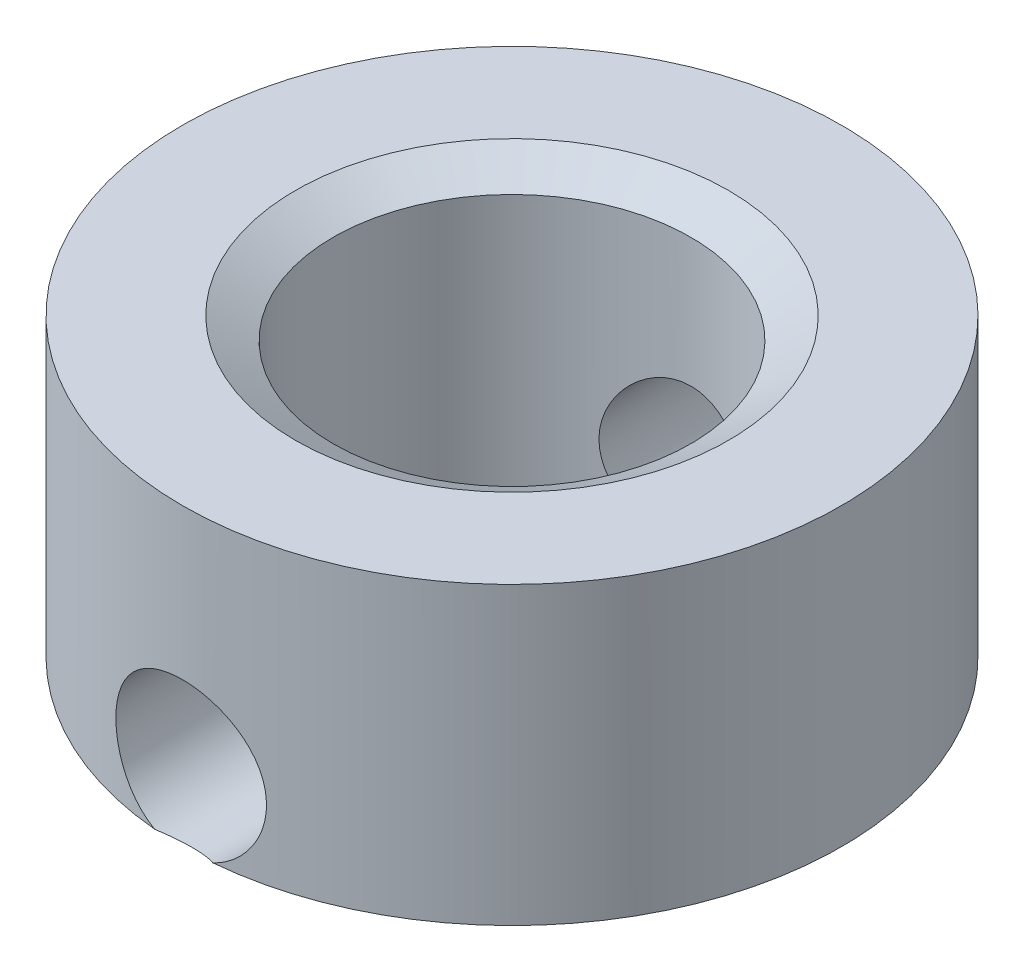
ISO-10303-21;
HEADER;
FILE_DESCRIPTION(('STEP AP214'),'2;1');
FILE_NAME('part.step','',(''),(''),'','','');
FILE_SCHEMA(('AUTOMOTIVE_DESIGN { 1 0 10303 214 1 1 1 1 }'));
ENDSEC;
DATA;
#1=APPLICATION_CONTEXT('core data for automotive mechanical design processes');
#2=APPLICATION_PROTOCOL_DEFINITION('international standard','automotive_design',2000,#1);
#3=PRODUCT_CONTEXT('',#1,'mechanical');
#4=PRODUCT('Part','Part','',(#3));
#5=PRODUCT_RELATED_PRODUCT_CATEGORY('part','',(#4));
#6=PRODUCT_DEFINITION_FORMATION('','',#4);
#7=PRODUCT_DEFINITION_CONTEXT('part definition',#1,'design');
#8=PRODUCT_DEFINITION('design','',#6,#7);
#9=PRODUCT_DEFINITION_SHAPE('','',#8);
#10=(LENGTH_UNIT() NAMED_UNIT(*) SI_UNIT(.MILLI.,.METRE.));
#11=(NAMED_UNIT(*) PLANE_ANGLE_UNIT() SI_UNIT($,.RADIAN.));
#12=(NAMED_UNIT(*) SI_UNIT($,.STERADIAN.) SOLID_ANGLE_UNIT());
#13=UNCERTAINTY_MEASURE_WITH_UNIT(LENGTH_MEASURE(1.E-05),#10,'distance_accuracy_value','');
#14=(GEOMETRIC_REPRESENTATION_CONTEXT(3) GLOBAL_UNCERTAINTY_ASSIGNED_CONTEXT((#13)) GLOBAL_UNIT_ASSIGNED_CONTEXT((#10,
#11,#12)) REPRESENTATION_CONTEXT('',''));
#15=CARTESIAN_POINT('',(0.,0.,0.));
#16=DIRECTION('',(0.,0.,1.));
#17=DIRECTION('',(1.,0.,0.));
#18=AXIS2_PLACEMENT_3D('',#15,#16,#17);
#19=CARTESIAN_POINT('',(0.,4.5,0.));
#20=DIRECTION('',(0.,1.,0.));
#21=DIRECTION('',(0.,0.,1.));
#22=AXIS2_PLACEMENT_3D('',#19,#20,#21);
#23=PLANE('',#22);
#24=CARTESIAN_POINT('',(0.,4.5,0.));
#25=DIRECTION('',(0.,1.,0.));
#26=DIRECTION('',(0.,0.,1.));
#27=AXIS2_PLACEMENT_3D('',#24,#25,#26);
#28=CIRCLE('',#27,2.875);
#29=CARTESIAN_POINT('',(0.,4.5,2.875));
#30=VERTEX_POINT('',#29);
#31=EDGE_CURVE('E89',#30,#30,#28,.F.);
#32=ORIENTED_EDGE('',*,*,#31,.T.);
#33=EDGE_LOOP('',(#32));
#34=FACE_BOUND('',#33,.T.);
#35=CARTESIAN_POINT('',(0.,4.5,0.));
#36=DIRECTION('',(0.,1.,0.));
#37=DIRECTION('',(0.,0.,1.));
#38=AXIS2_PLACEMENT_3D('',#35,#36,#37);
#39=CIRCLE('',#38,4.375);
#40=CARTESIAN_POINT('',(0.,4.5,4.375));
#41=VERTEX_POINT('',#40);
#42=EDGE_CURVE('E140',#41,#41,#39,.T.);
#43=ORIENTED_EDGE('',*,*,#42,.T.);
#44=EDGE_LOOP('',(#43));
#45=FACE_BOUND('',#44,.T.);
#46=ADVANCED_FACE('F43',(#34,#45),#23,.T.);
#47=CARTESIAN_POINT('',(0.,0.,0.));
#48=DIRECTION('',(0.,1.,0.));
#49=DIRECTION('',(0.,0.,1.));
#50=AXIS2_PLACEMENT_3D('',#47,#48,#49);
#51=PLANE('',#50);
#52=CARTESIAN_POINT('',(0.,0.,0.));
#53=DIRECTION('',(0.,1.,0.));
#54=DIRECTION('',(0.,0.,1.));
#55=AXIS2_PLACEMENT_3D('',#52,#53,#54);
#56=CIRCLE('',#55,3.37499999999999);
#57=CARTESIAN_POINT('',(0.,0.,3.37499999999999));
#58=VERTEX_POINT('',#57);
#59=EDGE_CURVE('E87',#58,#58,#56,.F.);
#60=ORIENTED_EDGE('',*,*,#59,.T.);
#61=EDGE_LOOP('',(#60));
#62=FACE_BOUND('',#61,.T.);
#63=CARTESIAN_POINT('',(0.,0.,0.));
#64=DIRECTION('',(0.,1.,0.));
#65=DIRECTION('',(0.,0.,1.));
#66=AXIS2_PLACEMENT_3D('',#63,#64,#65);
#67=CIRCLE('',#66,2.375);
#68=CARTESIAN_POINT('',(0.,0.,2.375));
#69=VERTEX_POINT('',#68);
#70=EDGE_CURVE('E137',#69,#69,#67,.T.);
#71=ORIENTED_EDGE('',*,*,#70,.T.);
#72=EDGE_LOOP('',(#71));
#73=FACE_BOUND('',#72,.T.);
#74=ADVANCED_FACE('F159',(#62,#73),#51,.F.);
#75=CARTESIAN_POINT('',(0.,4.5,0.));
#76=DIRECTION('',(0.,-1.,0.));
#77=DIRECTION('',(0.,0.,-1.));
#78=AXIS2_PLACEMENT_3D('',#75,#76,#77);
#79=CYLINDRICAL_SURFACE('',#78,4.375);
#80=CARTESIAN_POINT('',(0.,0.577350269189627,0.));
#81=DIRECTION('',(0.,1.,0.));
#82=DIRECTION('',(0.,0.,1.));
#83=AXIS2_PLACEMENT_3D('',#80,#81,#82);
#84=CIRCLE('',#83,4.375);
#85=CARTESIAN_POINT('',(0.385639046564443,0.577350269189627,4.35797057421971));
#86=VERTEX_POINT('',#85);
#87=CARTESIAN_POINT('',(0.385639046564441,0.577350269189627,-4.35797057421971));
#88=VERTEX_POINT('',#87);
#89=EDGE_CURVE('E83',#86,#88,#84,.T.);
#90=ORIENTED_EDGE('',*,*,#89,.T.);
#91=CARTESIAN_POINT('',(0.385639046564441,0.577350269189627,-4.35797057421971));
#92=CARTESIAN_POINT('',(0.437837138768085,0.59912366488534,-4.35337284208879));
#93=CARTESIAN_POINT('',(0.48806335456881,0.625357592024147,-4.34796166240015));
#94=CARTESIAN_POINT('',(0.583293663923035,0.685798372905159,-4.33620175231287));
#95=CARTESIAN_POINT('',(0.628301714984607,0.719999124498384,-4.3298537408327));
#96=CARTESIAN_POINT('',(0.711904229149971,0.795464574706755,-4.31689987137397));
#97=CARTESIAN_POINT('',(0.75049816784178,0.836729850351563,-4.31029399236686));
#98=CARTESIAN_POINT('',(0.820230809754612,0.925202914252376,-4.29756930237245));
#99=CARTESIAN_POINT('',(0.851370256937677,0.972410108783774,-4.29145044282108));
#100=CARTESIAN_POINT('',(0.90538895049128,1.07166253121622,-4.28038116559537));
#101=CARTESIAN_POINT('',(0.928241987754362,1.12372246632768,-4.27543447217037));
#102=CARTESIAN_POINT('',(0.964832873113558,1.23108952128967,-4.26732664902278));
#103=CARTESIAN_POINT('',(0.978571286096006,1.28639643967446,-4.26416540864706));
#104=CARTESIAN_POINT('',(0.996279863501409,1.39743213840691,-4.26006258765467));
#105=CARTESIAN_POINT('',(1.00045032527791,1.45312730309694,-4.25907551065762));
#106=CARTESIAN_POINT('',(0.999472649112615,1.56442537987171,-4.25930509312393));
#107=CARTESIAN_POINT('',(0.994325787927333,1.62002830355126,-4.26052145064979));
#108=CARTESIAN_POINT('',(0.975040051701498,1.72868201248082,-4.2649755017056));
#109=CARTESIAN_POINT('',(0.961039810634135,1.78175881552301,-4.26818201750638));
#110=CARTESIAN_POINT('',(0.92461408404878,1.88480655233746,-4.27622020811059));
#111=CARTESIAN_POINT('',(0.902187694149147,1.93477715204859,-4.28105205735583));
#112=CARTESIAN_POINT('',(0.849170866822247,2.03100949040229,-4.2918846191669));
#113=CARTESIAN_POINT('',(0.818465301137485,2.07720593625198,-4.29790146483002));
#114=CARTESIAN_POINT('',(0.749889930402069,2.16386693345846,-4.31039464229127));
#115=CARTESIAN_POINT('',(0.712019142529459,2.20433069715538,-4.31687103704746));
#116=CARTESIAN_POINT('',(0.629205761787017,2.27928555071445,-4.32972461752977));
#117=CARTESIAN_POINT('',(0.584127309179201,2.3136276454466,-4.33609658430183));
#118=CARTESIAN_POINT('',(0.488731753575174,2.37426258543232,-4.3478813885186));
#119=CARTESIAN_POINT('',(0.438414797008112,2.40055565559514,-4.35329425276117));
#120=CARTESIAN_POINT('',(0.334156231742419,2.44420288395706,-4.36253239077621));
#121=CARTESIAN_POINT('',(0.280231108862681,2.46159492771723,-4.36636437950079));
#122=CARTESIAN_POINT('',(0.170122104916162,2.48704100113827,-4.37203833405487));
#123=CARTESIAN_POINT('',(0.11393859510322,2.49509655917119,-4.37388062559215));
#124=CARTESIAN_POINT('',(0.00227753677916026,2.50152444638524,-4.37534764984299));
#125=CARTESIAN_POINT('',(-0.0531870181730645,2.50011277737093,-4.37502185048709));
#126=CARTESIAN_POINT('',(-0.163068982882941,2.48816118313409,-4.37230536084262));
#127=CARTESIAN_POINT('',(-0.217486430077825,2.47762158488451,-4.36991474451817));
#128=CARTESIAN_POINT('',(-0.323402976501873,2.44784946347301,-4.36335146725667));
#129=CARTESIAN_POINT('',(-0.374918076886366,2.4286712384596,-4.35918994624923));
#130=CARTESIAN_POINT('',(-0.47401957808577,2.3822138650679,-4.3495301008744));
#131=CARTESIAN_POINT('',(-0.521605519587053,2.35493377130017,-4.34403162051371));
#132=CARTESIAN_POINT('',(-0.612502075018356,2.29242808591182,-4.33215998867399));
#133=CARTESIAN_POINT('',(-0.655711652833183,2.25705841035833,-4.32577191797324));
#134=CARTESIAN_POINT('',(-0.735653111873501,2.17964061577438,-4.31289719787117));
#135=CARTESIAN_POINT('',(-0.772384205935712,2.13759168636432,-4.30641053659454));
#136=CARTESIAN_POINT('',(-0.838930021563498,2.04717296303349,-4.29394799496083));
#137=CARTESIAN_POINT('',(-0.868621113131013,1.9987106204027,-4.28798226478267));
#138=CARTESIAN_POINT('',(-0.919419132552872,1.89734299405332,-4.27737891166385));
#139=CARTESIAN_POINT('',(-0.940526872886316,1.84443813142508,-4.272741163032));
#140=CARTESIAN_POINT('',(-0.973285174167288,1.73635782455319,-4.26539817950396));
#141=CARTESIAN_POINT('',(-0.985048637779161,1.68121822165849,-4.26266992256855));
#142=CARTESIAN_POINT('',(-0.999150668125083,1.56968637134676,-4.25938693748562));
#143=CARTESIAN_POINT('',(-1.00149073411443,1.51329432462822,-4.25883186358675));
#144=CARTESIAN_POINT('',(-0.996724287488905,1.40221718591014,-4.25994955126337));
#145=CARTESIAN_POINT('',(-0.989830105918217,1.3475223225633,-4.2615722393479));
#146=CARTESIAN_POINT('',(-0.967193526916235,1.24009617866149,-4.26676631580845));
#147=CARTESIAN_POINT('',(-0.951451229664215,1.1873648758821,-4.27033768212131));
#148=CARTESIAN_POINT('',(-0.91155294937496,1.08516316161242,-4.279031617275));
#149=CARTESIAN_POINT('',(-0.887373887498587,1.03570214205094,-4.28415843599656));
#150=CARTESIAN_POINT('',(-0.831295357791379,0.941470391671096,-4.29539143696006));
#151=CARTESIAN_POINT('',(-0.799392697298352,0.896701611452733,-4.30149802385048));
#152=CARTESIAN_POINT('',(-0.727868804206991,0.811991232776005,-4.31418378345739));
#153=CARTESIAN_POINT('',(-0.688078581934498,0.772193673157085,-4.32077084171924));
#154=CARTESIAN_POINT('',(-0.602382136925864,0.699830164894146,-4.33354664566679));
#155=CARTESIAN_POINT('',(-0.556483957981798,0.667254852907632,-4.33973589960452));
#156=CARTESIAN_POINT('',(-0.488494337827592,0.627131963277403,-4.34768839968129));
#157=CARTESIAN_POINT('',(-0.468399524334859,0.616186462137701,-4.34990229862132));
#158=CARTESIAN_POINT('',(-0.427522609597282,0.59570740711636,-4.3541096230934));
#159=CARTESIAN_POINT('',(-0.406741700952545,0.586171546261914,-4.35610340747292));
#160=CARTESIAN_POINT('',(-0.385639046564482,0.577350269189562,-4.35797057421974));
#161=B_SPLINE_CURVE_WITH_KNOTS('',3,(#91,#92,#93,#94,#95,#96,#97,#98,#99,#100,#101,#102,#103,
#104,#105,#106,#107,#108,#109,#110,#111,#112,#113,#114,#115,#116,#117,#118,#119,#120,#121,#122,
#123,#124,#125,#126,#127,#128,#129,#130,#131,#132,#133,#134,#135,#136,#137,#138,#139,#140,#141,
#142,#143,#144,#145,#146,#147,#148,#149,#150,#151,#152,#153,#154,#155,#156,#157,#158,#159,#160),
.UNSPECIFIED.,.F.,.F.,(4,2,2,2,2,2,2,2,2,2,2,2,2,2,2,2,2,2,2,2,2,2,2,2,2,2,2,2,2,2,2,2,2,2,4),
(0.,0.169974130788077,0.339818496362486,0.509676741433377,0.679518027491314,0.849891913264008,
1.02025523898843,1.1870182657462,1.353758442629,1.51795020413997,1.68215959344936,
1.84878204852067,2.01542737505085,2.1856961078306,2.35596008245511,2.52549320393364,
2.69499856911249,2.8606499140652,3.02629532544126,3.19091379399071,3.35555147906341,
3.52338811797732,3.6912451357279,3.86186166890661,4.03246204817879,4.2009683801398,
4.3694479018139,4.53411918062051,4.69878859503954,4.86391204190117,5.02910386184217,
5.1983169838892,5.36730942842313,5.43623313227425,5.50504275837262),.UNSPECIFIED.);
#162=CARTESIAN_POINT('',(-0.385639046564443,0.577350269189627,-4.35797057421971));
#163=VERTEX_POINT('',#162);
#164=EDGE_CURVE('E70',#88,#163,#161,.T.);
#165=ORIENTED_EDGE('',*,*,#164,.T.);
#166=CARTESIAN_POINT('',(-0.385639046564441,0.577350269189627,4.35797057421971));
#167=VERTEX_POINT('',#166);
#168=EDGE_CURVE('E81',#163,#167,#84,.T.);
#169=ORIENTED_EDGE('',*,*,#168,.T.);
#170=CARTESIAN_POINT('',(-0.385639046564441,0.577350269189627,4.35797057421971));
#171=CARTESIAN_POINT('',(-0.437837138768085,0.59912366488534,4.35337284208879));
#172=CARTESIAN_POINT('',(-0.48806335456881,0.625357592024147,4.34796166240015));
#173=CARTESIAN_POINT('',(-0.583293663923035,0.685798372905159,4.33620175231287));
#174=CARTESIAN_POINT('',(-0.628301714984607,0.719999124498384,4.3298537408327));
#175=CARTESIAN_POINT('',(-0.711904229149971,0.795464574706755,4.31689987137397));
#176=CARTESIAN_POINT('',(-0.75049816784178,0.836729850351563,4.31029399236686));
#177=CARTESIAN_POINT('',(-0.820230809754612,0.925202914252376,4.29756930237245));
#178=CARTESIAN_POINT('',(-0.851370256937677,0.972410108783774,4.29145044282108));
#179=CARTESIAN_POINT('',(-0.90538895049128,1.07166253121622,4.28038116559537));
#180=CARTESIAN_POINT('',(-0.928241987754362,1.12372246632768,4.27543447217037));
#181=CARTESIAN_POINT('',(-0.964832873113558,1.23108952128967,4.26732664902278));
#182=CARTESIAN_POINT('',(-0.978571286096006,1.28639643967446,4.26416540864706));
#183=CARTESIAN_POINT('',(-0.996279863501409,1.39743213840691,4.26006258765467));
#184=CARTESIAN_POINT('',(-1.00045032527791,1.45312730309694,4.25907551065762));
#185=CARTESIAN_POINT('',(-0.999472649112615,1.56442537987171,4.25930509312393));
#186=CARTESIAN_POINT('',(-0.994325787927333,1.62002830355126,4.26052145064979));
#187=CARTESIAN_POINT('',(-0.975040051701498,1.72868201248082,4.2649755017056));
#188=CARTESIAN_POINT('',(-0.961039810634135,1.78175881552301,4.26818201750638));
#189=CARTESIAN_POINT('',(-0.92461408404878,1.88480655233746,4.27622020811059));
#190=CARTESIAN_POINT('',(-0.902187694149147,1.93477715204859,4.28105205735583));
#191=CARTESIAN_POINT('',(-0.849170866822247,2.03100949040229,4.2918846191669));
#192=CARTESIAN_POINT('',(-0.818465301137485,2.07720593625198,4.29790146483002));
#193=CARTESIAN_POINT('',(-0.749889930402069,2.16386693345846,4.31039464229127));
#194=CARTESIAN_POINT('',(-0.712019142529459,2.20433069715538,4.31687103704746));
#195=CARTESIAN_POINT('',(-0.629205761787017,2.27928555071445,4.32972461752977));
#196=CARTESIAN_POINT('',(-0.584127309179201,2.3136276454466,4.33609658430183));
#197=CARTESIAN_POINT('',(-0.488731753575174,2.37426258543232,4.3478813885186));
#198=CARTESIAN_POINT('',(-0.438414797008112,2.40055565559514,4.35329425276117));
#199=CARTESIAN_POINT('',(-0.334156231742419,2.44420288395706,4.36253239077621));
#200=CARTESIAN_POINT('',(-0.280231108862681,2.46159492771723,4.36636437950079));
#201=CARTESIAN_POINT('',(-0.170122104916162,2.48704100113827,4.37203833405487));
#202=CARTESIAN_POINT('',(-0.11393859510322,2.49509655917119,4.37388062559215));
#203=CARTESIAN_POINT('',(-0.00227753677916026,2.50152444638524,4.37534764984299));
#204=CARTESIAN_POINT('',(0.0531870181730645,2.50011277737093,4.37502185048709));
#205=CARTESIAN_POINT('',(0.163068982882941,2.48816118313409,4.37230536084262));
#206=CARTESIAN_POINT('',(0.217486430077825,2.47762158488451,4.36991474451817));
#207=CARTESIAN_POINT('',(0.323402976501873,2.44784946347301,4.36335146725667));
#208=CARTESIAN_POINT('',(0.374918076886366,2.4286712384596,4.35918994624923));
#209=CARTESIAN_POINT('',(0.47401957808577,2.3822138650679,4.3495301008744));
#210=CARTESIAN_POINT('',(0.521605519587053,2.35493377130017,4.34403162051371));
#211=CARTESIAN_POINT('',(0.612502075018356,2.29242808591182,4.33215998867399));
#212=CARTESIAN_POINT('',(0.655711652833183,2.25705841035833,4.32577191797324));
#213=CARTESIAN_POINT('',(0.735653111873501,2.17964061577438,4.31289719787117));
#214=CARTESIAN_POINT('',(0.772384205935712,2.13759168636432,4.30641053659454));
#215=CARTESIAN_POINT('',(0.838930021563498,2.04717296303349,4.29394799496083));
#216=CARTESIAN_POINT('',(0.868621113131013,1.9987106204027,4.28798226478267));
#217=CARTESIAN_POINT('',(0.919419132552872,1.89734299405332,4.27737891166385));
#218=CARTESIAN_POINT('',(0.940526872886316,1.84443813142508,4.272741163032));
#219=CARTESIAN_POINT('',(0.973285174167288,1.73635782455319,4.26539817950396));
#220=CARTESIAN_POINT('',(0.985048637779161,1.68121822165849,4.26266992256855));
#221=CARTESIAN_POINT('',(0.999150668125083,1.56968637134676,4.25938693748562));
#222=CARTESIAN_POINT('',(1.00149073411443,1.51329432462822,4.25883186358675));
#223=CARTESIAN_POINT('',(0.996724287488905,1.40221718591014,4.25994955126337));
#224=CARTESIAN_POINT('',(0.989830105918217,1.3475223225633,4.2615722393479));
#225=CARTESIAN_POINT('',(0.967193526916235,1.24009617866149,4.26676631580845));
#226=CARTESIAN_POINT('',(0.951451229664215,1.1873648758821,4.27033768212131));
#227=CARTESIAN_POINT('',(0.91155294937496,1.08516316161242,4.279031617275));
#228=CARTESIAN_POINT('',(0.887373887498587,1.03570214205094,4.28415843599656));
#229=CARTESIAN_POINT('',(0.831295357791379,0.941470391671096,4.29539143696006));
#230=CARTESIAN_POINT('',(0.799392697298352,0.896701611452733,4.30149802385048));
#231=CARTESIAN_POINT('',(0.727868804206991,0.811991232776005,4.31418378345739));
#232=CARTESIAN_POINT('',(0.688078581934498,0.772193673157085,4.32077084171924));
#233=CARTESIAN_POINT('',(0.602382136925864,0.699830164894146,4.33354664566679));
#234=CARTESIAN_POINT('',(0.556483957981798,0.667254852907632,4.33973589960452));
#235=CARTESIAN_POINT('',(0.488494337827592,0.627131963277403,4.34768839968129));
#236=CARTESIAN_POINT('',(0.468399524334859,0.616186462137701,4.34990229862132));
#237=CARTESIAN_POINT('',(0.427522609597282,0.59570740711636,4.3541096230934));
#238=CARTESIAN_POINT('',(0.406741700952545,0.586171546261914,4.35610340747292));
#239=CARTESIAN_POINT('',(0.385639046564482,0.577350269189562,4.35797057421974));
#240=B_SPLINE_CURVE_WITH_KNOTS('',3,(#170,#171,#172,#173,#174,#175,#176,#177,#178,#179,#180,
#181,#182,#183,#184,#185,#186,#187,#188,#189,#190,#191,#192,#193,#194,#195,#196,#197,#198,#199,
#200,#201,#202,#203,#204,#205,#206,#207,#208,#209,#210,#211,#212,#213,#214,#215,#216,#217,#218,
#219,#220,#221,#222,#223,#224,#225,#226,#227,#228,#229,#230,#231,#232,#233,#234,#235,#236,#237,
#238,#239),.UNSPECIFIED.,.F.,.F.,(4,2,2,2,2,2,2,2,2,2,2,2,2,2,2,2,2,2,2,2,2,2,2,2,2,2,2,2,2,2,2,
2,2,2,4),(0.,0.169974130788077,0.339818496362486,0.509676741433377,0.679518027491314,
0.849891913264008,1.02025523898843,1.1870182657462,1.353758442629,1.51795020413997,
1.68215959344936,1.84878204852067,2.01542737505085,2.1856961078306,2.35596008245511,
2.52549320393364,2.69499856911249,2.8606499140652,3.02629532544126,3.19091379399071,
3.35555147906341,3.52338811797732,3.6912451357279,3.86186166890661,4.03246204817879,
4.2009683801398,4.3694479018139,4.53411918062051,4.69878859503954,4.86391204190117,
5.02910386184217,5.1983169838892,5.36730942842313,5.43623313227425,5.50504275837262),.UNSPECIFIED.);
#241=EDGE_CURVE('E63',#167,#86,#240,.T.);
#242=ORIENTED_EDGE('',*,*,#241,.T.);
#243=EDGE_LOOP('',(#90,#165,#169,#242));
#244=FACE_BOUND('',#243,.T.);
#245=ORIENTED_EDGE('',*,*,#42,.F.);
#246=EDGE_LOOP('',(#245));
#247=FACE_BOUND('',#246,.T.);
#248=ADVANCED_FACE('F78',(#244,#247),#79,.T.);
#249=CARTESIAN_POINT('',(0.,4.5,0.));
#250=DIRECTION('',(0.,-1.,0.));
#251=DIRECTION('',(0.,0.,-1.));
#252=AXIS2_PLACEMENT_3D('',#249,#250,#251);
#253=CYLINDRICAL_SURFACE('',#252,2.375);
#254=CARTESIAN_POINT('',(0.,2.50000000000023,-2.375));
#255=CARTESIAN_POINT('',(-0.0535182311842291,2.49999407266521,-2.37499552615053));
#256=CARTESIAN_POINT('',(-0.107118123083695,2.49567829476599,-2.37317014970485));
#257=CARTESIAN_POINT('',(-0.21279656593495,2.478569575537,-2.36604441304696));
#258=CARTESIAN_POINT('',(-0.26487083082461,2.46575477200875,-2.3607350913931));
#259=CARTESIAN_POINT('',(-0.365795203092426,2.43220739727708,-2.34721142367568));
#260=CARTESIAN_POINT('',(-0.414655665083937,2.41150187916149,-2.33900701039012));
#261=CARTESIAN_POINT('',(-0.508161423375105,2.36287367856176,-2.32048959539291));
#262=CARTESIAN_POINT('',(-0.552807941775334,2.33495309737814,-2.31017720778592));
#263=CARTESIAN_POINT('',(-0.638969418268696,2.27118284963998,-2.28788443763063));
#264=CARTESIAN_POINT('',(-0.680241115637809,2.23502404340008,-2.27584868394197));
#265=CARTESIAN_POINT('',(-0.756344564268912,2.15645775183523,-2.25170270589666));
#266=CARTESIAN_POINT('',(-0.791172857995765,2.11404693348039,-2.2395924451398));
#267=CARTESIAN_POINT('',(-0.855139847786728,2.02158591813422,-2.21598355464145));
#268=CARTESIAN_POINT('',(-0.883902481955316,1.97125812120207,-2.20454667979136));
#269=CARTESIAN_POINT('',(-0.932445348101207,1.86592797801697,-2.18446010484187));
#270=CARTESIAN_POINT('',(-0.952230303929113,1.81092810823241,-2.17580893966273));
#271=CARTESIAN_POINT('',(-0.981246240391551,1.70061536753835,-2.16287390090004));
#272=CARTESIAN_POINT('',(-0.990945951285275,1.64544928617034,-2.15839717358726));
#273=CARTESIAN_POINT('',(-1.00097781447887,1.53410492808848,-2.15376466331486));
#274=CARTESIAN_POINT('',(-1.00131529113269,1.47792724487037,-2.15360642440803));
#275=CARTESIAN_POINT('',(-0.992965600360537,1.37086956335316,-2.15746590822481));
#276=CARTESIAN_POINT('',(-0.98498565539461,1.31992021882329,-2.16115639167549));
#277=CARTESIAN_POINT('',(-0.961415814055412,1.22016531070691,-2.17174348326645));
#278=CARTESIAN_POINT('',(-0.94582442370877,1.17136017003513,-2.17864072081527));
#279=CARTESIAN_POINT('',(-0.907168953170892,1.07603315760325,-2.19502085952181));
#280=CARTESIAN_POINT('',(-0.883951491992008,1.02958288817241,-2.20455613905296));
#281=CARTESIAN_POINT('',(-0.830811627959944,0.941054472011196,-2.22512640502561));
#282=CARTESIAN_POINT('',(-0.800886549895779,0.898978079550061,-2.23616198914341));
#283=CARTESIAN_POINT('',(-0.732144026386389,0.816562156155686,-2.25965004937599));
#284=CARTESIAN_POINT('',(-0.692781394713058,0.77668745540317,-2.27214252844279));
#285=CARTESIAN_POINT('',(-0.607806642028627,0.703947295906063,-2.29633323030041));
#286=CARTESIAN_POINT('',(-0.562192999452261,0.671083548699988,-2.30803125867312));
#287=CARTESIAN_POINT('',(-0.464572974109677,0.612596739965269,-2.32966783268859));
#288=CARTESIAN_POINT('',(-0.412439343945023,0.587166583972274,-2.33955736015428));
#289=CARTESIAN_POINT('',(-0.304111131205661,0.545601394613617,-2.35608481379855));
#290=CARTESIAN_POINT('',(-0.24791886198305,0.529461112512319,-2.36272457576156));
#291=CARTESIAN_POINT('',(-0.136949715041601,0.5079156000659,-2.37165919098985));
#292=CARTESIAN_POINT('',(-0.082314181453574,0.50188679685505,-2.37420598633277));
#293=CARTESIAN_POINT('',(0.0272429711048881,0.49887155615006,-2.37547475700855));
#294=CARTESIAN_POINT('',(0.0821645009480135,0.501882452322595,-2.37419786017101));
#295=CARTESIAN_POINT('',(0.187789099032221,0.516418142434943,-2.36812564047689));
#296=CARTESIAN_POINT('',(0.238564581301693,0.5275016857001,-2.36351275201184));
#297=CARTESIAN_POINT('',(0.337477742049347,0.557250225406959,-2.35142894883656));
#298=CARTESIAN_POINT('',(0.385615088176097,0.575916174597059,-2.34395767496987));
#299=CARTESIAN_POINT('',(0.479579114954908,0.620908404461297,-2.32658204182085));
#300=CARTESIAN_POINT('',(0.525287152585731,0.647455139897015,-2.316609157394));
#301=CARTESIAN_POINT('',(0.611763886720925,0.70721360589687,-2.29529011912484));
#302=CARTESIAN_POINT('',(0.652530490989037,0.740428143953652,-2.28394338762264));
#303=CARTESIAN_POINT('',(0.731092627154775,0.815410657529003,-2.26007416110219));
#304=CARTESIAN_POINT('',(0.768454858856892,0.85762568734277,-2.24752625725172));
#305=CARTESIAN_POINT('',(0.835689557591186,0.947920173129559,-2.22340437232821));
#306=CARTESIAN_POINT('',(0.865560187829507,0.996001063009668,-2.21183063056186));
#307=CARTESIAN_POINT('',(0.917325145335036,1.09773154044764,-2.19087537643573));
#308=CARTESIAN_POINT('',(0.939088099388603,1.15145614955459,-2.1815307858818));
#309=CARTESIAN_POINT('',(0.973069853895559,1.26232548486043,-2.16658972192908));
#310=CARTESIAN_POINT('',(0.985296749456947,1.31946726577121,-2.16099007004907));
#311=CARTESIAN_POINT('',(0.999046827660388,1.43073046399337,-2.15466527576584));
#312=CARTESIAN_POINT('',(1.00133281739003,1.48473826955792,-2.15359294107459));
#313=CARTESIAN_POINT('',(0.99718144568469,1.59233793123478,-2.15551842209533));
#314=CARTESIAN_POINT('',(0.990745493194914,1.64592985312266,-2.15851558042032));
#315=CARTESIAN_POINT('',(0.969978175405767,1.74849269555263,-2.1679221539143));
#316=CARTESIAN_POINT('',(0.956045196022045,1.79756165133825,-2.17415888572626));
#317=CARTESIAN_POINT('',(0.921073446344675,1.89267425284891,-2.18920284601826));
#318=CARTESIAN_POINT('',(0.90003267069888,1.93871704040436,-2.1980107998325));
#319=CARTESIAN_POINT('',(0.849970035121428,2.02952877206502,-2.21786881535723));
#320=CARTESIAN_POINT('',(0.820540552850374,2.07404986942716,-2.22902267034322));
#321=CARTESIAN_POINT('',(0.755100191520932,2.15776028074021,-2.2520325897407));
#322=CARTESIAN_POINT('',(0.719086953576366,2.19694767487759,-2.26388890480337));
#323=CARTESIAN_POINT('',(0.638295111244019,2.27190549194308,-2.28803627361645));
#324=CARTESIAN_POINT('',(0.593061557745554,2.30719887811028,-2.300293192585));
#325=CARTESIAN_POINT('',(0.4968626897261,2.3697224477202,-2.32297027950048));
#326=CARTESIAN_POINT('',(0.445894785193952,2.39694896729835,-2.33338961197292));
#327=CARTESIAN_POINT('',(0.340420418890864,2.4419934430166,-2.35107504229108));
#328=CARTESIAN_POINT('',(0.28598287848238,2.45995373627556,-2.35838851828232));
#329=CARTESIAN_POINT('',(0.174583362537997,2.48629363764587,-2.36923021348262));
#330=CARTESIAN_POINT('',(0.11762984340568,2.4947031287219,-2.37277023708561));
#331=CARTESIAN_POINT('',(0.0403069279868913,2.499392949501,-2.37474500626022));
#332=CARTESIAN_POINT('',(0.0201592573297277,2.50000223270989,-2.37500168521045));
#333=CARTESIAN_POINT('',(0.,2.50000000000023,-2.375));
#334=B_SPLINE_CURVE_WITH_KNOTS('',3,(#254,#255,#256,#257,#258,#259,#260,#261,#262,#263,#264,
#265,#266,#267,#268,#269,#270,#271,#272,#273,#274,#275,#276,#277,#278,#279,#280,#281,#282,#283,
#284,#285,#286,#287,#288,#289,#290,#291,#292,#293,#294,#295,#296,#297,#298,#299,#300,#301,#302,
#303,#304,#305,#306,#307,#308,#309,#310,#311,#312,#313,#314,#315,#316,#317,#318,#319,#320,#321,
#322,#323,#324,#325,#326,#327,#328,#329,#330,#331,#332,#333),.UNSPECIFIED.,.T.,.F.,(4,2,2,2,2,2,
2,2,2,2,2,2,2,2,2,2,2,2,2,2,2,2,2,2,2,2,2,2,2,2,2,2,2,2,2,2,2,2,2,4),(0.,0.160496416713629,
0.321407290881711,0.481771378875988,0.642088815287751,0.80988533863753,0.977771642209967,
1.15413467891162,1.33040480947091,1.49805633568335,1.66561251559782,1.81999933347394,
1.97441646656292,2.13215187176121,2.28995029914937,2.46139418705842,2.6328798806763,
2.80848511145881,2.98399102846067,3.1482110865974,3.31238271144298,3.46819627671143,
3.62402942640574,3.78471551782782,3.94546940891685,4.11794331478389,4.29045946662372,
4.46566054807491,4.64071273991339,4.80206495496038,4.96339110822798,5.1168868947073,
5.27042602381095,5.43330465296533,5.59624175449565,5.7714050070839,5.94664769498732,
6.11911173420064,6.29103466085203,6.35149048111058),.UNSPECIFIED.);
#335=CARTESIAN_POINT('',(0.,2.50000000000023,-2.375));
#336=VERTEX_POINT('',#335);
#337=EDGE_CURVE('E131',#336,#336,#334,.T.);
#338=ORIENTED_EDGE('',*,*,#337,.F.);
#339=EDGE_LOOP('',(#338));
#340=FACE_BOUND('',#339,.T.);
#341=CARTESIAN_POINT('',(1.,1.50000000000023,2.15421099245176));
#342=CARTESIAN_POINT('',(0.999993873385576,1.44672024489328,2.15421696847622));
#343=CARTESIAN_POINT('',(0.995714916365659,1.39335586685754,2.15621651981043));
#344=CARTESIAN_POINT('',(0.97876595486611,1.28817065203618,2.16396001082285));
#345=CARTESIAN_POINT('',(0.9660733871984,1.23635435839079,2.16971401835681));
#346=CARTESIAN_POINT('',(0.932882628062108,1.13597844621084,2.18418837820992));
#347=CARTESIAN_POINT('',(0.912416713432984,1.08740632471239,2.19289644877112));
#348=CARTESIAN_POINT('',(0.864355059330525,0.994398670730484,2.21228028689488));
#349=CARTESIAN_POINT('',(0.836760901392133,0.949962223640872,2.2229556178333));
#350=CARTESIAN_POINT('',(0.773350788172772,0.863635952381236,2.24582986110723));
#351=CARTESIAN_POINT('',(0.737152512902207,0.822040692268075,2.25808113071464));
#352=CARTESIAN_POINT('',(0.658364159888766,0.745292836807263,2.28229696093675));
#353=CARTESIAN_POINT('',(0.615771598872019,0.710142756331685,2.29426140805885));
#354=CARTESIAN_POINT('',(0.523079147176004,0.645769408347882,2.31719421492846));
#355=CARTESIAN_POINT('',(0.472729683879261,0.616879101285576,2.32809464464577));
#356=CARTESIAN_POINT('',(0.36734327616254,0.568106456494925,2.34702860807011));
#357=CARTESIAN_POINT('',(0.312308467773263,0.548220039778151,2.35506343961415));
#358=CARTESIAN_POINT('',(0.202207761347785,0.519092021228782,2.36698930756438));
#359=CARTESIAN_POINT('',(0.147298142310365,0.509342049157654,2.37107741686434));
#360=CARTESIAN_POINT('',(0.0364803248127804,0.499119480828747,2.37536603892054));
#361=CARTESIAN_POINT('',(-0.019427449894944,0.498643037158578,2.3755681638981));
#362=CARTESIAN_POINT('',(-0.12695225377034,0.506718003939242,2.37217700906198));
#363=CARTESIAN_POINT('',(-0.178620074667775,0.514710418372173,2.36881873001594));
#364=CARTESIAN_POINT('',(-0.279801541058351,0.538535970520078,2.35900842658042));
#365=CARTESIAN_POINT('',(-0.329315027292347,0.554369686835428,2.35255617389139));
#366=CARTESIAN_POINT('',(-0.425693564463864,0.593614468813935,2.33705603244083));
#367=CARTESIAN_POINT('',(-0.472506576953263,0.617137636635426,2.32796998304289));
#368=CARTESIAN_POINT('',(-0.561643664422799,0.670982320866428,2.30808796316604));
#369=CARTESIAN_POINT('',(-0.603966134570646,0.701306255762933,2.29729138479122));
#370=CARTESIAN_POINT('',(-0.686148854857471,0.770421156205987,2.27415391495365));
#371=CARTESIAN_POINT('',(-0.725614423582502,0.809663588411654,2.26175780057093));
#372=CARTESIAN_POINT('',(-0.797577262856536,0.894231829581947,2.23739624103707));
#373=CARTESIAN_POINT('',(-0.830071729594393,0.939560074417544,2.2254309707776));
#374=CARTESIAN_POINT('',(-0.888213684359636,1.03696607306392,2.20288660127762));
#375=CARTESIAN_POINT('',(-0.913589338752317,1.08922150553017,2.19236882153753));
#376=CARTESIAN_POINT('',(-0.955018742253009,1.19782418470318,2.17464432713229));
#377=CARTESIAN_POINT('',(-0.971079320937941,1.25416839942999,2.16743518746769));
#378=CARTESIAN_POINT('',(-0.992407359503258,1.36539119816396,2.15774926129727));
#379=CARTESIAN_POINT('',(-0.998315879709623,1.42012198957996,2.15499212036451));
#380=CARTESIAN_POINT('',(-1.0010583399334,1.52985070115457,2.15372030084019));
#381=CARTESIAN_POINT('',(-0.997895531687784,1.58484851853843,2.15520410202651));
#382=CARTESIAN_POINT('',(-0.983170455954356,1.68972408071926,2.16195683139061));
#383=CARTESIAN_POINT('',(-0.972176207923,1.73970020942143,2.16696953285473));
#384=CARTESIAN_POINT('',(-0.942857311160377,1.83705504322159,2.17988526374937));
#385=CARTESIAN_POINT('',(-0.924530924758975,1.88443312957144,2.18778897829349));
#386=CARTESIAN_POINT('',(-0.880199661946931,1.97751364917689,2.2060075917075));
#387=CARTESIAN_POINT('',(-0.853899827796136,2.02305767915595,2.21641117951766));
#388=CARTESIAN_POINT('',(-0.79465958096249,2.10930793220647,2.2383336925043));
#389=CARTESIAN_POINT('',(-0.761716251498577,2.15001201781218,2.24985310641812));
#390=CARTESIAN_POINT('',(-0.686884349927081,2.22896408123717,2.27386944837153));
#391=CARTESIAN_POINT('',(-0.644478645296184,2.26672346000042,2.28636771174292));
#392=CARTESIAN_POINT('',(-0.553646094354158,2.33468126965952,2.31004361753712));
#393=CARTESIAN_POINT('',(-0.505218749997673,2.36487907451984,2.32122115057399));
#394=CARTESIAN_POINT('',(-0.403325048216352,2.41684710811677,2.34107958763213));
#395=CARTESIAN_POINT('',(-0.34984215949998,2.43858841012854,2.34975189658646));
#396=CARTESIAN_POINT('',(-0.23951816754406,2.47260347211911,2.36354359756493));
#397=CARTESIAN_POINT('',(-0.18267913275146,2.48488299930541,2.36866515367775));
#398=CARTESIAN_POINT('',(-0.0716186768618057,2.4988885132122,2.37452459501667));
#399=CARTESIAN_POINT('',(-0.0174985849506337,2.50130295550962,2.37554834109938));
#400=CARTESIAN_POINT('',(0.0903583744766115,2.49736946677054,2.37389283147893));
#401=CARTESIAN_POINT('',(0.144095309927105,2.4910231299301,2.37121424948708));
#402=CARTESIAN_POINT('',(0.247619725675691,2.47024255009075,2.36260691256444));
#403=CARTESIAN_POINT('',(0.297479773235333,2.45611450570073,2.35680137902917));
#404=CARTESIAN_POINT('',(0.394100292607394,2.42050932797198,2.34258336937593));
#405=CARTESIAN_POINT('',(0.440860180186771,2.39903081409134,2.33417040356632));
#406=CARTESIAN_POINT('',(0.532292303535643,2.34824697800271,2.315074551323));
#407=CARTESIAN_POINT('',(0.576773514309317,2.31863071371851,2.3043059828355));
#408=CARTESIAN_POINT('',(0.660325830763923,2.25286068368359,2.28176915970967));
#409=CARTESIAN_POINT('',(0.699394867469618,2.21670442992621,2.27000052552313));
#410=CARTESIAN_POINT('',(0.773849048119804,2.13591007171643,2.24575626832259));
#411=CARTESIAN_POINT('',(0.80878734520362,2.09085632761775,2.23328856976955));
#412=CARTESIAN_POINT('',(0.870677820712322,1.99514402009139,2.20989686099813));
#413=CARTESIAN_POINT('',(0.897625474144137,1.94448230315851,2.1989737272703));
#414=CARTESIAN_POINT('',(0.942510820429782,1.83903442588012,2.18011275300473));
#415=CARTESIAN_POINT('',(0.960485352279792,1.7842662088613,2.17216274069276));
#416=CARTESIAN_POINT('',(0.98674161464546,1.6721406967815,2.16036620621579));
#417=CARTESIAN_POINT('',(0.995055855972327,1.61479276442893,2.15650592433373));
#418=CARTESIAN_POINT('',(0.999456250266883,1.53815539699717,2.15446245666924));
#419=CARTESIAN_POINT('',(1.00000219435989,1.51908312640911,2.15420885202844));
#420=CARTESIAN_POINT('',(1.,1.50000000000023,2.15421099245176));
#421=B_SPLINE_CURVE_WITH_KNOTS('',3,(#341,#342,#343,#344,#345,#346,#347,#348,#349,#350,#351,
#352,#353,#354,#355,#356,#357,#358,#359,#360,#361,#362,#363,#364,#365,#366,#367,#368,#369,#370,
#371,#372,#373,#374,#375,#376,#377,#378,#379,#380,#381,#382,#383,#384,#385,#386,#387,#388,#389,
#390,#391,#392,#393,#394,#395,#396,#397,#398,#399,#400,#401,#402,#403,#404,#405,#406,#407,#408,
#409,#410,#411,#412,#413,#414,#415,#416,#417,#418,#419,#420),.UNSPECIFIED.,.T.,.F.,(4,2,2,2,2,2,
2,2,2,2,2,2,2,2,2,2,2,2,2,2,2,2,2,2,2,2,2,2,2,2,2,2,2,2,2,2,2,2,2,4),(0.,0.1597836717338,
0.319997586081303,0.479553399569691,0.639073842957012,0.807792006526237,0.976575863508415,
1.15286335615481,1.32907090603505,1.49593829998807,1.66273646232373,1.81917267152393,
1.97562042568704,2.13445907848193,2.29335430725828,2.46365284504897,2.63401974985639,
2.81020681778924,2.98626454601254,3.15072936592144,3.31513523862194,3.46869259947938,
3.62228637403172,3.78245118128135,3.94268646148561,4.11629645182123,4.28992081087356,
4.46413396177011,4.63824084085824,4.79996527240232,4.96166027888441,5.11740549128723,
5.273179971331,5.43602331630091,5.5989287425219,5.77319364795255,5.94755704959555,
6.12119859407037,6.29425405573873,6.35148352309741),.UNSPECIFIED.);
#422=CARTESIAN_POINT('',(1.,1.50000000000023,2.15421099245176));
#423=VERTEX_POINT('',#422);
#424=EDGE_CURVE('E126',#423,#423,#421,.T.);
#425=ORIENTED_EDGE('',*,*,#424,.F.);
#426=EDGE_LOOP('',(#425));
#427=FACE_BOUND('',#426,.T.);
#428=CARTESIAN_POINT('',(0.,4.21132486540519,0.));
#429=DIRECTION('',(0.,1.,0.));
#430=DIRECTION('',(0.,0.,1.));
#431=AXIS2_PLACEMENT_3D('',#428,#429,#430);
#432=CIRCLE('',#431,2.375);
#433=CARTESIAN_POINT('',(0.,4.21132486540519,2.375));
#434=VERTEX_POINT('',#433);
#435=EDGE_CURVE('E92',#434,#434,#432,.T.);
#436=ORIENTED_EDGE('',*,*,#435,.T.);
#437=EDGE_LOOP('',(#436));
#438=FACE_BOUND('',#437,.T.);
#439=ORIENTED_EDGE('',*,*,#70,.F.);
#440=EDGE_LOOP('',(#439));
#441=FACE_BOUND('',#440,.T.);
#442=ADVANCED_FACE('F106',(#340,#427,#438,#441),#253,.F.);
#443=CARTESIAN_POINT('',(0.,4.21132486540519,0.));
#444=DIRECTION('',(0.,1.,0.));
#445=DIRECTION('',(0.,0.,1.));
#446=AXIS2_PLACEMENT_3D('',#443,#444,#445);
#447=CONICAL_SURFACE('',#446,2.375,1.0471975511966);
#448=ORIENTED_EDGE('',*,*,#31,.F.);
#449=EDGE_LOOP('',(#448));
#450=FACE_BOUND('',#449,.T.);
#451=ORIENTED_EDGE('',*,*,#435,.F.);
#452=EDGE_LOOP('',(#451));
#453=FACE_BOUND('',#452,.T.);
#454=ADVANCED_FACE('F147',(#450,#453),#447,.F.);
#455=CARTESIAN_POINT('',(0.,0.577350269189627,0.));
#456=DIRECTION('',(0.,1.,0.));
#457=DIRECTION('',(0.,0.,1.));
#458=AXIS2_PLACEMENT_3D('',#455,#456,#457);
#459=CONICAL_SURFACE('',#458,4.375,1.0471975511966);
#460=CARTESIAN_POINT('',(-0.404100248062801,0.585285296108579,4.37010019840208));
#461=CARTESIAN_POINT('',(-0.376585287135511,0.573115663348967,4.35147621040128));
#462=CARTESIAN_POINT('',(-0.34759056825341,0.561806029239559,4.33425860024103));
#463=CARTESIAN_POINT('',(-0.286723914077487,0.541448043489769,4.30337402074246));
#464=CARTESIAN_POINT('',(-0.254830397774186,0.532418931119261,4.28973722457079));
#465=CARTESIAN_POINT('',(-0.188497845423241,0.517334907874353,4.26701295903613));
#466=CARTESIAN_POINT('',(-0.154043856196002,0.511299355779177,4.25795509368708));
#467=CARTESIAN_POINT('',(-0.0838226933307742,0.502896133883545,4.24535670956655));
#468=CARTESIAN_POINT('',(-0.0480613396264817,0.500513852834878,4.24179421174755));
#469=CARTESIAN_POINT('',(0.0207322408697344,0.499670882601283,4.24053300614969));
#470=CARTESIAN_POINT('',(0.0537533600795588,0.500911045758456,4.24238699796644));
#471=CARTESIAN_POINT('',(0.118934873978447,0.506558207332514,4.25084552967944));
#472=CARTESIAN_POINT('',(0.151094053260013,0.510969456225658,4.25745644569778));
#473=CARTESIAN_POINT('',(0.212800762969123,0.522413844035641,4.27465943539235));
#474=CARTESIAN_POINT('',(0.242396367920247,0.529369536602965,4.28513398156633));
#475=CARTESIAN_POINT('',(0.299509495164309,0.545445268396032,4.3094326519206));
#476=CARTESIAN_POINT('',(0.327027721377738,0.554564570103336,4.32325563473901));
#477=CARTESIAN_POINT('',(0.370811635153741,0.571105592786208,4.34843318138814));
#478=CARTESIAN_POINT('',(0.387709105479606,0.578042490200764,4.3590170518749));
#479=CARTESIAN_POINT('',(0.404100248062804,0.585285296108574,4.37010019840208));
#480=B_SPLINE_CURVE_WITH_KNOTS('',3,(#460,#461,#462,#463,#464,#465,#466,#467,#468,#469,#470,
#471,#472,#473,#474,#475,#476,#477,#478,#479),.UNSPECIFIED.,.F.,.F.,(4,2,2,2,2,2,2,2,2,4),(0.,
0.106260279923343,0.213389127115863,0.321202005929631,0.428582552344309,0.527352425289844,
0.626254935351031,0.722368358478246,0.818449065975818,0.881696297462278),.UNSPECIFIED.);
#481=EDGE_CURVE('E11',#167,#86,#480,.T.);
#482=ORIENTED_EDGE('',*,*,#481,.F.);
#483=ORIENTED_EDGE('',*,*,#168,.F.);
#484=CARTESIAN_POINT('',(0.404100248062801,0.585285296108579,-4.37010019840208));
#485=CARTESIAN_POINT('',(0.376585287135511,0.573115663348967,-4.35147621040128));
#486=CARTESIAN_POINT('',(0.34759056825341,0.56180602923956,-4.33425860024103));
#487=CARTESIAN_POINT('',(0.286723914077487,0.541448043489769,-4.30337402074246));
#488=CARTESIAN_POINT('',(0.254830397774187,0.532418931119261,-4.28973722457079));
#489=CARTESIAN_POINT('',(0.188497845423241,0.517334907874354,-4.26701295903613));
#490=CARTESIAN_POINT('',(0.154043856196003,0.511299355779177,-4.25795509368708));
#491=CARTESIAN_POINT('',(0.0838226933307747,0.502896133883546,-4.24535670956655));
#492=CARTESIAN_POINT('',(0.0480613396264822,0.500513852834878,-4.24179421174755));
#493=CARTESIAN_POINT('',(-0.020732240869734,0.499670882601282,-4.24053300614969));
#494=CARTESIAN_POINT('',(-0.0537533600795584,0.500911045758456,-4.24238699796644));
#495=CARTESIAN_POINT('',(-0.118934873978447,0.506558207332513,-4.25084552967944));
#496=CARTESIAN_POINT('',(-0.151094053260013,0.510969456225658,-4.25745644569778));
#497=CARTESIAN_POINT('',(-0.212800762969122,0.522413844035641,-4.27465943539235));
#498=CARTESIAN_POINT('',(-0.242396367920247,0.529369536602965,-4.28513398156633));
#499=CARTESIAN_POINT('',(-0.299509495164309,0.545445268396032,-4.3094326519206));
#500=CARTESIAN_POINT('',(-0.327027721377738,0.554564570103336,-4.32325563473901));
#501=CARTESIAN_POINT('',(-0.370811635153741,0.571105592786208,-4.34843318138814));
#502=CARTESIAN_POINT('',(-0.387709105479606,0.578042490200764,-4.3590170518749));
#503=CARTESIAN_POINT('',(-0.404100248062804,0.585285296108573,-4.37010019840208));
#504=B_SPLINE_CURVE_WITH_KNOTS('',3,(#484,#485,#486,#487,#488,#489,#490,#491,#492,#493,#494,
#495,#496,#497,#498,#499,#500,#501,#502,#503),.UNSPECIFIED.,.F.,.F.,(4,2,2,2,2,2,2,2,2,4),(0.,
0.106260279923342,0.213389127115863,0.321202005929631,0.428582552344308,0.527352425289844,
0.626254935351031,0.722368358478246,0.818449065975818,0.881696297462278),.UNSPECIFIED.);
#505=EDGE_CURVE('E58',#88,#163,#504,.T.);
#506=ORIENTED_EDGE('',*,*,#505,.F.);
#507=ORIENTED_EDGE('',*,*,#89,.F.);
#508=EDGE_LOOP('',(#482,#483,#506,#507));
#509=FACE_BOUND('',#508,.T.);
#510=ORIENTED_EDGE('',*,*,#59,.F.);
#511=EDGE_LOOP('',(#510));
#512=FACE_BOUND('',#511,.T.);
#513=ADVANCED_FACE('F46',(#509,#512),#459,.T.);
#514=CARTESIAN_POINT('',(0.,1.50000000000023,-4.375));
#515=DIRECTION('',(0.,0.,1.));
#516=DIRECTION('',(1.,0.,0.));
#517=AXIS2_PLACEMENT_3D('',#514,#515,#516);
#518=CYLINDRICAL_SURFACE('',#517,1.);
#519=ORIENTED_EDGE('',*,*,#337,.T.);
#520=EDGE_LOOP('',(#519));
#521=FACE_BOUND('',#520,.T.);
#522=ORIENTED_EDGE('',*,*,#505,.T.);
#523=ORIENTED_EDGE('',*,*,#164,.F.);
#524=EDGE_LOOP('',(#522,#523));
#525=FACE_BOUND('',#524,.T.);
#526=ADVANCED_FACE('F85',(#521,#525),#518,.F.);
#527=ORIENTED_EDGE('',*,*,#424,.T.);
#528=EDGE_LOOP('',(#527));
#529=FACE_BOUND('',#528,.T.);
#530=ORIENTED_EDGE('',*,*,#481,.T.);
#531=ORIENTED_EDGE('',*,*,#241,.F.);
#532=EDGE_LOOP('',(#530,#531));
#533=FACE_BOUND('',#532,.T.);
#534=ADVANCED_FACE('F104',(#529,#533),#518,.F.);
#535=CLOSED_SHELL('',(#46,#74,#248,#442,#454,#513,#526,#534));
#536=MANIFOLD_SOLID_BREP('B2',#535);
#537=ADVANCED_BREP_SHAPE_REPRESENTATION('',(#18,#536),#14);
#538=SHAPE_DEFINITION_REPRESENTATION(#9,#537);
ENDSEC;
END-ISO-10303-21;
